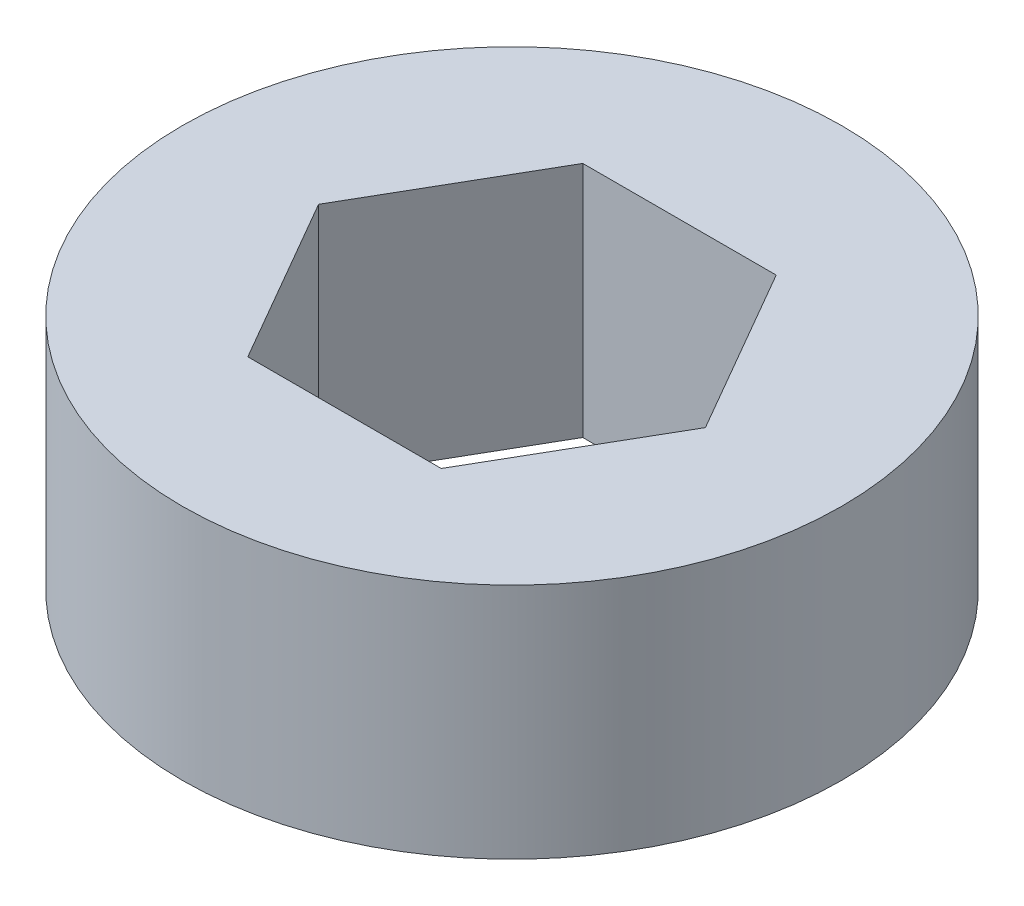
ISO-10303-21;
HEADER;
FILE_DESCRIPTION(('STEP AP214'),'2;1');
FILE_NAME('part.step','',(''),(''),'','','');
FILE_SCHEMA(('AUTOMOTIVE_DESIGN { 1 0 10303 214 1 1 1 1 }'));
ENDSEC;
DATA;
#1=APPLICATION_CONTEXT('core data for automotive mechanical design processes');
#2=APPLICATION_PROTOCOL_DEFINITION('international standard','automotive_design',2000,#1);
#3=PRODUCT_CONTEXT('',#1,'mechanical');
#4=PRODUCT('Part','Part','',(#3));
#5=PRODUCT_RELATED_PRODUCT_CATEGORY('part','',(#4));
#6=PRODUCT_DEFINITION_FORMATION('','',#4);
#7=PRODUCT_DEFINITION_CONTEXT('part definition',#1,'design');
#8=PRODUCT_DEFINITION('design','',#6,#7);
#9=PRODUCT_DEFINITION_SHAPE('','',#8);
#10=(LENGTH_UNIT() NAMED_UNIT(*) SI_UNIT(.MILLI.,.METRE.));
#11=(NAMED_UNIT(*) PLANE_ANGLE_UNIT() SI_UNIT($,.RADIAN.));
#12=(NAMED_UNIT(*) SI_UNIT($,.STERADIAN.) SOLID_ANGLE_UNIT());
#13=UNCERTAINTY_MEASURE_WITH_UNIT(LENGTH_MEASURE(1.E-05),#10,'distance_accuracy_value','');
#14=(GEOMETRIC_REPRESENTATION_CONTEXT(3) GLOBAL_UNCERTAINTY_ASSIGNED_CONTEXT((#13)) GLOBAL_UNIT_ASSIGNED_CONTEXT((#10,
#11,#12)) REPRESENTATION_CONTEXT('',''));
#15=CARTESIAN_POINT('',(0.,0.,0.));
#16=DIRECTION('',(0.,0.,1.));
#17=DIRECTION('',(1.,0.,0.));
#18=AXIS2_PLACEMENT_3D('',#15,#16,#17);
#19=CARTESIAN_POINT('',(0.,9.,0.));
#20=DIRECTION('',(0.,1.,0.));
#21=DIRECTION('',(0.,0.,1.));
#22=AXIS2_PLACEMENT_3D('',#19,#20,#21);
#23=PLANE('',#22);
#24=CARTESIAN_POINT('',(0.,9.,0.));
#25=DIRECTION('',(0.,1.,0.));
#26=DIRECTION('',(0.,0.,1.));
#27=AXIS2_PLACEMENT_3D('',#24,#25,#26);
#28=CIRCLE('',#27,12.5);
#29=CARTESIAN_POINT('',(0.,9.,12.5));
#30=VERTEX_POINT('',#29);
#31=EDGE_CURVE('E11',#30,#30,#28,.T.);
#32=ORIENTED_EDGE('',*,*,#31,.T.);
#33=EDGE_LOOP('',(#32));
#34=FACE_BOUND('',#33,.T.);
#35=DIRECTION('',(-0.500000000000001,0.,-0.866025403784438));
#36=VECTOR('',#35,1.);
#37=CARTESIAN_POINT('',(7.33234841870824,9.,0.));
#38=LINE('',#37,#36);
#39=CARTESIAN_POINT('',(7.33234841870824,9.,0.));
#40=VERTEX_POINT('',#39);
#41=CARTESIAN_POINT('',(3.6661742093541,9.,-6.35));
#42=VERTEX_POINT('',#41);
#43=EDGE_CURVE('E102',#40,#42,#38,.T.);
#44=ORIENTED_EDGE('',*,*,#43,.F.);
#45=DIRECTION('',(0.499999999999995,0.,-0.866025403784441));
#46=VECTOR('',#45,1.);
#47=CARTESIAN_POINT('',(3.66617420935419,9.,6.34999999999995));
#48=LINE('',#47,#46);
#49=CARTESIAN_POINT('',(3.66617420935419,9.,6.34999999999995));
#50=VERTEX_POINT('',#49);
#51=EDGE_CURVE('E93',#50,#40,#48,.T.);
#52=ORIENTED_EDGE('',*,*,#51,.F.);
#53=DIRECTION('',(1.,0.,0.));
#54=VECTOR('',#53,1.);
#55=CARTESIAN_POINT('',(-3.66617420935406,9.,6.35000000000003));
#56=LINE('',#55,#54);
#57=CARTESIAN_POINT('',(-3.66617420935406,9.,6.35000000000003));
#58=VERTEX_POINT('',#57);
#59=EDGE_CURVE('E127',#58,#50,#56,.T.);
#60=ORIENTED_EDGE('',*,*,#59,.F.);
#61=DIRECTION('',(0.500000000000007,0.,0.866025403784434));
#62=VECTOR('',#61,1.);
#63=CARTESIAN_POINT('',(-7.33234841870824,9.,0.));
#64=LINE('',#63,#62);
#65=CARTESIAN_POINT('',(-7.33234841870824,9.,0.));
#66=VERTEX_POINT('',#65);
#67=EDGE_CURVE('E124',#66,#58,#64,.T.);
#68=ORIENTED_EDGE('',*,*,#67,.F.);
#69=DIRECTION('',(-0.499999999999995,0.,0.866025403784442));
#70=VECTOR('',#69,1.);
#71=CARTESIAN_POINT('',(-3.66617420935415,9.,-6.34999999999998));
#72=LINE('',#71,#70);
#73=CARTESIAN_POINT('',(-3.66617420935415,9.,-6.34999999999998));
#74=VERTEX_POINT('',#73);
#75=EDGE_CURVE('E119',#74,#66,#72,.T.);
#76=ORIENTED_EDGE('',*,*,#75,.F.);
#77=DIRECTION('',(-1.,0.,0.));
#78=VECTOR('',#77,1.);
#79=CARTESIAN_POINT('',(3.6661742093541,9.,-6.35));
#80=LINE('',#79,#78);
#81=EDGE_CURVE('E115',#42,#74,#80,.T.);
#82=ORIENTED_EDGE('',*,*,#81,.F.);
#83=EDGE_LOOP('',(#44,#52,#60,#68,#76,#82));
#84=FACE_BOUND('',#83,.T.);
#85=ADVANCED_FACE('F39',(#34,#84),#23,.T.);
#86=CARTESIAN_POINT('',(0.,0.,0.));
#87=DIRECTION('',(0.,1.,0.));
#88=DIRECTION('',(0.,0.,1.));
#89=AXIS2_PLACEMENT_3D('',#86,#87,#88);
#90=PLANE('',#89);
#91=CARTESIAN_POINT('',(0.,0.,0.));
#92=DIRECTION('',(0.,1.,0.));
#93=DIRECTION('',(0.,0.,1.));
#94=AXIS2_PLACEMENT_3D('',#91,#92,#93);
#95=CIRCLE('',#94,12.5);
#96=CARTESIAN_POINT('',(0.,0.,12.5));
#97=VERTEX_POINT('',#96);
#98=EDGE_CURVE('E43',#97,#97,#95,.T.);
#99=ORIENTED_EDGE('',*,*,#98,.F.);
#100=EDGE_LOOP('',(#99));
#101=FACE_BOUND('',#100,.T.);
#102=DIRECTION('',(0.499999999999995,0.,-0.866025403784441));
#103=VECTOR('',#102,1.);
#104=CARTESIAN_POINT('',(3.66617420935419,0.,6.34999999999995));
#105=LINE('',#104,#103);
#106=CARTESIAN_POINT('',(3.66617420935419,0.,6.34999999999995));
#107=VERTEX_POINT('',#106);
#108=CARTESIAN_POINT('',(7.33234841870824,0.,0.));
#109=VERTEX_POINT('',#108);
#110=EDGE_CURVE('E63',#107,#109,#105,.T.);
#111=ORIENTED_EDGE('',*,*,#110,.T.);
#112=DIRECTION('',(-0.500000000000001,0.,-0.866025403784438));
#113=VECTOR('',#112,1.);
#114=CARTESIAN_POINT('',(7.33234841870824,0.,0.));
#115=LINE('',#114,#113);
#116=CARTESIAN_POINT('',(3.6661742093541,0.,-6.35));
#117=VERTEX_POINT('',#116);
#118=EDGE_CURVE('E109',#109,#117,#115,.T.);
#119=ORIENTED_EDGE('',*,*,#118,.T.);
#120=DIRECTION('',(-1.,0.,0.));
#121=VECTOR('',#120,1.);
#122=CARTESIAN_POINT('',(3.6661742093541,0.,-6.35));
#123=LINE('',#122,#121);
#124=CARTESIAN_POINT('',(-3.66617420935415,0.,-6.34999999999998));
#125=VERTEX_POINT('',#124);
#126=EDGE_CURVE('E134',#117,#125,#123,.T.);
#127=ORIENTED_EDGE('',*,*,#126,.T.);
#128=DIRECTION('',(-0.499999999999995,0.,0.866025403784442));
#129=VECTOR('',#128,1.);
#130=CARTESIAN_POINT('',(-3.66617420935415,0.,-6.34999999999998));
#131=LINE('',#130,#129);
#132=CARTESIAN_POINT('',(-7.33234841870824,0.,0.));
#133=VERTEX_POINT('',#132);
#134=EDGE_CURVE('E138',#125,#133,#131,.T.);
#135=ORIENTED_EDGE('',*,*,#134,.T.);
#136=DIRECTION('',(0.500000000000007,0.,0.866025403784434));
#137=VECTOR('',#136,1.);
#138=CARTESIAN_POINT('',(-7.33234841870824,0.,0.));
#139=LINE('',#138,#137);
#140=CARTESIAN_POINT('',(-3.66617420935406,0.,6.35000000000003));
#141=VERTEX_POINT('',#140);
#142=EDGE_CURVE('E142',#133,#141,#139,.T.);
#143=ORIENTED_EDGE('',*,*,#142,.T.);
#144=DIRECTION('',(1.,0.,0.));
#145=VECTOR('',#144,1.);
#146=CARTESIAN_POINT('',(-3.66617420935406,0.,6.35000000000003));
#147=LINE('',#146,#145);
#148=EDGE_CURVE('E103',#141,#107,#147,.T.);
#149=ORIENTED_EDGE('',*,*,#148,.T.);
#150=EDGE_LOOP('',(#111,#119,#127,#135,#143,#149));
#151=FACE_BOUND('',#150,.T.);
#152=ADVANCED_FACE('F166',(#101,#151),#90,.F.);
#153=CARTESIAN_POINT('',(0.,9.,0.));
#154=DIRECTION('',(0.,-1.,0.));
#155=DIRECTION('',(0.,0.,-1.));
#156=AXIS2_PLACEMENT_3D('',#153,#154,#155);
#157=CYLINDRICAL_SURFACE('',#156,12.5);
#158=ORIENTED_EDGE('',*,*,#31,.F.);
#159=EDGE_LOOP('',(#158));
#160=FACE_BOUND('',#159,.T.);
#161=ORIENTED_EDGE('',*,*,#98,.T.);
#162=EDGE_LOOP('',(#161));
#163=FACE_BOUND('',#162,.T.);
#164=ADVANCED_FACE('F41',(#160,#163),#157,.T.);
#165=CARTESIAN_POINT('',(3.66617420935419,9.,6.34999999999995));
#166=DIRECTION('',(-0.866025403784442,0.,-0.499999999999995));
#167=DIRECTION('',(-0.499999999999995,0.,0.866025403784442));
#168=AXIS2_PLACEMENT_3D('',#165,#166,#167);
#169=PLANE('',#168);
#170=ORIENTED_EDGE('',*,*,#110,.F.);
#171=DIRECTION('',(0.,-1.,0.));
#172=VECTOR('',#171,1.);
#173=CARTESIAN_POINT('',(3.66617420935419,9.,6.34999999999995));
#174=LINE('',#173,#172);
#175=EDGE_CURVE('E97',#50,#107,#174,.T.);
#176=ORIENTED_EDGE('',*,*,#175,.F.);
#177=ORIENTED_EDGE('',*,*,#51,.T.);
#178=DIRECTION('',(0.,-1.,0.));
#179=VECTOR('',#178,1.);
#180=CARTESIAN_POINT('',(7.33234841870824,9.,0.));
#181=LINE('',#180,#179);
#182=EDGE_CURVE('E96',#40,#109,#181,.T.);
#183=ORIENTED_EDGE('',*,*,#182,.T.);
#184=EDGE_LOOP('',(#170,#176,#177,#183));
#185=FACE_BOUND('',#184,.T.);
#186=ADVANCED_FACE('F95',(#185),#169,.T.);
#187=CARTESIAN_POINT('',(7.33234841870824,9.,0.));
#188=DIRECTION('',(-0.866025403784438,0.,0.500000000000001));
#189=DIRECTION('',(0.500000000000001,0.,0.866025403784438));
#190=AXIS2_PLACEMENT_3D('',#187,#188,#189);
#191=PLANE('',#190);
#192=ORIENTED_EDGE('',*,*,#118,.F.);
#193=ORIENTED_EDGE('',*,*,#182,.F.);
#194=ORIENTED_EDGE('',*,*,#43,.T.);
#195=DIRECTION('',(0.,-1.,0.));
#196=VECTOR('',#195,1.);
#197=CARTESIAN_POINT('',(3.6661742093541,9.,-6.35));
#198=LINE('',#197,#196);
#199=EDGE_CURVE('E111',#42,#117,#198,.T.);
#200=ORIENTED_EDGE('',*,*,#199,.T.);
#201=EDGE_LOOP('',(#192,#193,#194,#200));
#202=FACE_BOUND('',#201,.T.);
#203=ADVANCED_FACE('F106',(#202),#191,.T.);
#204=CARTESIAN_POINT('',(3.6661742093541,9.,-6.35));
#205=DIRECTION('',(0.,0.,1.));
#206=DIRECTION('',(1.,0.,0.));
#207=AXIS2_PLACEMENT_3D('',#204,#205,#206);
#208=PLANE('',#207);
#209=ORIENTED_EDGE('',*,*,#126,.F.);
#210=ORIENTED_EDGE('',*,*,#199,.F.);
#211=ORIENTED_EDGE('',*,*,#81,.T.);
#212=DIRECTION('',(0.,-1.,0.));
#213=VECTOR('',#212,1.);
#214=CARTESIAN_POINT('',(-3.66617420935415,9.,-6.34999999999998));
#215=LINE('',#214,#213);
#216=EDGE_CURVE('E156',#74,#125,#215,.T.);
#217=ORIENTED_EDGE('',*,*,#216,.T.);
#218=EDGE_LOOP('',(#209,#210,#211,#217));
#219=FACE_BOUND('',#218,.T.);
#220=ADVANCED_FACE('F162',(#219),#208,.T.);
#221=CARTESIAN_POINT('',(-3.66617420935415,9.,-6.34999999999998));
#222=DIRECTION('',(0.866025403784442,0.,0.499999999999995));
#223=DIRECTION('',(0.499999999999995,0.,-0.866025403784442));
#224=AXIS2_PLACEMENT_3D('',#221,#222,#223);
#225=PLANE('',#224);
#226=ORIENTED_EDGE('',*,*,#134,.F.);
#227=ORIENTED_EDGE('',*,*,#216,.F.);
#228=ORIENTED_EDGE('',*,*,#75,.T.);
#229=DIRECTION('',(0.,-1.,0.));
#230=VECTOR('',#229,1.);
#231=CARTESIAN_POINT('',(-7.33234841870824,9.,0.));
#232=LINE('',#231,#230);
#233=EDGE_CURVE('E153',#66,#133,#232,.T.);
#234=ORIENTED_EDGE('',*,*,#233,.T.);
#235=EDGE_LOOP('',(#226,#227,#228,#234));
#236=FACE_BOUND('',#235,.T.);
#237=ADVANCED_FACE('F174',(#236),#225,.T.);
#238=CARTESIAN_POINT('',(-7.33234841870824,9.,0.));
#239=DIRECTION('',(0.866025403784435,0.,-0.500000000000007));
#240=DIRECTION('',(-0.500000000000007,0.,-0.866025403784435));
#241=AXIS2_PLACEMENT_3D('',#238,#239,#240);
#242=PLANE('',#241);
#243=ORIENTED_EDGE('',*,*,#142,.F.);
#244=ORIENTED_EDGE('',*,*,#233,.F.);
#245=ORIENTED_EDGE('',*,*,#67,.T.);
#246=DIRECTION('',(0.,-1.,0.));
#247=VECTOR('',#246,1.);
#248=CARTESIAN_POINT('',(-3.66617420935406,9.,6.35000000000003));
#249=LINE('',#248,#247);
#250=EDGE_CURVE('E55',#58,#141,#249,.T.);
#251=ORIENTED_EDGE('',*,*,#250,.T.);
#252=EDGE_LOOP('',(#243,#244,#245,#251));
#253=FACE_BOUND('',#252,.T.);
#254=ADVANCED_FACE('F172',(#253),#242,.T.);
#255=CARTESIAN_POINT('',(-3.66617420935406,9.,6.35000000000003));
#256=DIRECTION('',(0.,0.,-1.));
#257=DIRECTION('',(-1.,0.,0.));
#258=AXIS2_PLACEMENT_3D('',#255,#256,#257);
#259=PLANE('',#258);
#260=ORIENTED_EDGE('',*,*,#148,.F.);
#261=ORIENTED_EDGE('',*,*,#250,.F.);
#262=ORIENTED_EDGE('',*,*,#59,.T.);
#263=ORIENTED_EDGE('',*,*,#175,.T.);
#264=EDGE_LOOP('',(#260,#261,#262,#263));
#265=FACE_BOUND('',#264,.T.);
#266=ADVANCED_FACE('F168',(#265),#259,.T.);
#267=CLOSED_SHELL('',(#85,#152,#164,#186,#203,#220,#237,#254,#266));
#268=MANIFOLD_SOLID_BREP('B2',#267);
#269=ADVANCED_BREP_SHAPE_REPRESENTATION('',(#18,#268),#14);
#270=SHAPE_DEFINITION_REPRESENTATION(#9,#269);
ENDSEC;
END-ISO-10303-21;
